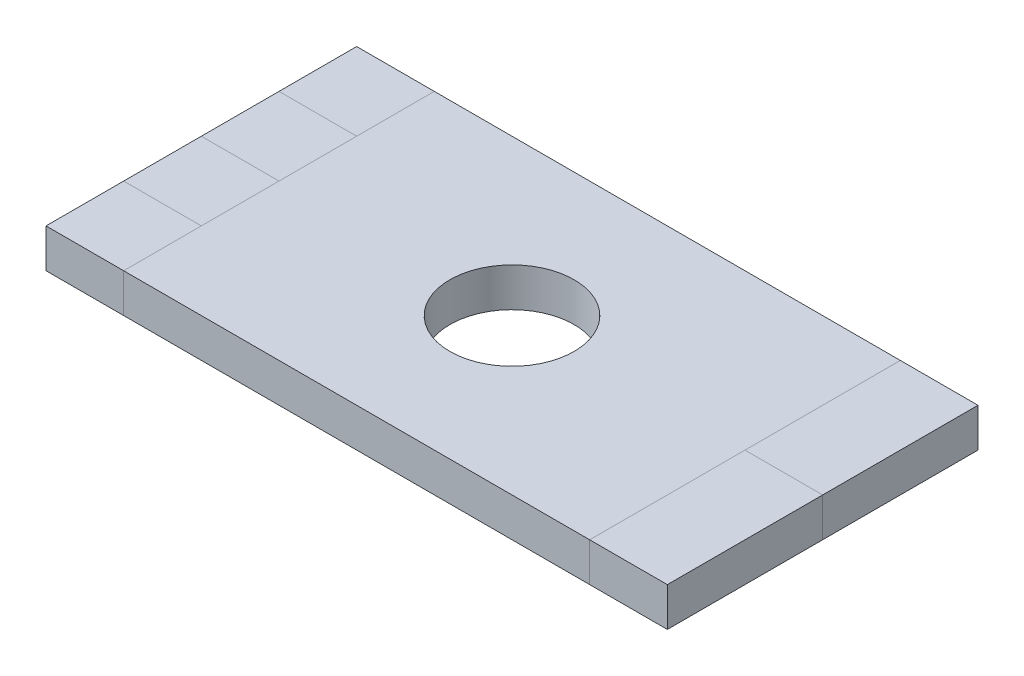
ISO-10303-21;
HEADER;
FILE_DESCRIPTION(('STEP AP214'),'2;1');
FILE_NAME('part.step','',(''),(''),'','','');
FILE_SCHEMA(('AUTOMOTIVE_DESIGN { 1 0 10303 214 1 1 1 1 }'));
ENDSEC;
DATA;
#1=APPLICATION_CONTEXT('core data for automotive mechanical design processes');
#2=APPLICATION_PROTOCOL_DEFINITION('international standard','automotive_design',2000,#1);
#3=PRODUCT_CONTEXT('',#1,'mechanical');
#4=PRODUCT('Part','Part','',(#3));
#5=PRODUCT_RELATED_PRODUCT_CATEGORY('part','',(#4));
#6=PRODUCT_DEFINITION_FORMATION('','',#4);
#7=PRODUCT_DEFINITION_CONTEXT('part definition',#1,'design');
#8=PRODUCT_DEFINITION('design','',#6,#7);
#9=PRODUCT_DEFINITION_SHAPE('','',#8);
#10=(LENGTH_UNIT() NAMED_UNIT(*) SI_UNIT(.MILLI.,.METRE.));
#11=(NAMED_UNIT(*) PLANE_ANGLE_UNIT() SI_UNIT($,.RADIAN.));
#12=(NAMED_UNIT(*) SI_UNIT($,.STERADIAN.) SOLID_ANGLE_UNIT());
#13=UNCERTAINTY_MEASURE_WITH_UNIT(LENGTH_MEASURE(1.E-05),#10,'distance_accuracy_value','');
#14=(GEOMETRIC_REPRESENTATION_CONTEXT(3) GLOBAL_UNCERTAINTY_ASSIGNED_CONTEXT((#13)) GLOBAL_UNIT_ASSIGNED_CONTEXT((#10,
#11,#12)) REPRESENTATION_CONTEXT('',''));
#15=CARTESIAN_POINT('',(0.,0.,0.));
#16=DIRECTION('',(0.,0.,1.));
#17=DIRECTION('',(1.,0.,0.));
#18=AXIS2_PLACEMENT_3D('',#15,#16,#17);
#19=CARTESIAN_POINT('',(25.4,0.,0.));
#20=DIRECTION('',(0.,0.,1.));
#21=DIRECTION('',(1.,0.,0.));
#22=AXIS2_PLACEMENT_3D('',#19,#20,#21);
#23=PLANE('',#22);
#24=DIRECTION('',(0.,1.,0.));
#25=VECTOR('',#24,1.);
#26=CARTESIAN_POINT('',(19.05,0.,0.));
#27=LINE('',#26,#25);
#28=CARTESIAN_POINT('',(19.05,0.,0.));
#29=VERTEX_POINT('',#28);
#30=CARTESIAN_POINT('',(19.05,3.175,0.));
#31=VERTEX_POINT('',#30);
#32=EDGE_CURVE('E114',#29,#31,#27,.T.);
#33=ORIENTED_EDGE('',*,*,#32,.F.);
#34=DIRECTION('',(-1.,0.,0.));
#35=VECTOR('',#34,1.);
#36=CARTESIAN_POINT('',(25.4,0.,0.));
#37=LINE('',#36,#35);
#38=CARTESIAN_POINT('',(25.4,0.,0.));
#39=VERTEX_POINT('',#38);
#40=EDGE_CURVE('E12',#39,#29,#37,.T.);
#41=ORIENTED_EDGE('',*,*,#40,.F.);
#42=DIRECTION('',(0.,1.,0.));
#43=VECTOR('',#42,1.);
#44=CARTESIAN_POINT('',(25.4,0.,0.));
#45=LINE('',#44,#43);
#46=CARTESIAN_POINT('',(25.4,3.175,0.));
#47=VERTEX_POINT('',#46);
#48=EDGE_CURVE('E102',#39,#47,#45,.T.);
#49=ORIENTED_EDGE('',*,*,#48,.T.);
#50=DIRECTION('',(-1.,0.,0.));
#51=VECTOR('',#50,1.);
#52=CARTESIAN_POINT('',(25.4,3.175,0.));
#53=LINE('',#52,#51);
#54=EDGE_CURVE('E91',#47,#31,#53,.T.);
#55=ORIENTED_EDGE('',*,*,#54,.T.);
#56=EDGE_LOOP('',(#33,#41,#49,#55));
#57=FACE_BOUND('',#56,.T.);
#58=ADVANCED_FACE('F52',(#57),#23,.T.);
#59=CARTESIAN_POINT('',(25.4,0.,0.));
#60=DIRECTION('',(0.,1.,0.));
#61=DIRECTION('',(0.,0.,1.));
#62=AXIS2_PLACEMENT_3D('',#59,#60,#61);
#63=PLANE('',#62);
#64=DIRECTION('',(0.,0.,-1.));
#65=VECTOR('',#64,1.);
#66=CARTESIAN_POINT('',(19.05,0.,0.));
#67=LINE('',#66,#65);
#68=CARTESIAN_POINT('',(19.05,0.,-12.7));
#69=VERTEX_POINT('',#68);
#70=EDGE_CURVE('E107',#29,#69,#67,.T.);
#71=ORIENTED_EDGE('',*,*,#70,.T.);
#72=DIRECTION('',(-1.,0.,0.));
#73=VECTOR('',#72,1.);
#74=CARTESIAN_POINT('',(25.4,0.,-12.7));
#75=LINE('',#74,#73);
#76=CARTESIAN_POINT('',(25.4,0.,-12.7));
#77=VERTEX_POINT('',#76);
#78=EDGE_CURVE('E60',#77,#69,#75,.T.);
#79=ORIENTED_EDGE('',*,*,#78,.F.);
#80=DIRECTION('',(0.,0.,-1.));
#81=VECTOR('',#80,1.);
#82=CARTESIAN_POINT('',(25.4,0.,0.));
#83=LINE('',#82,#81);
#84=EDGE_CURVE('E97',#39,#77,#83,.T.);
#85=ORIENTED_EDGE('',*,*,#84,.F.);
#86=ORIENTED_EDGE('',*,*,#40,.T.);
#87=EDGE_LOOP('',(#71,#79,#85,#86));
#88=FACE_BOUND('',#87,.T.);
#89=ADVANCED_FACE('F105',(#88),#63,.F.);
#90=CARTESIAN_POINT('',(25.4,0.,-12.7));
#91=DIRECTION('',(0.,0.,1.));
#92=DIRECTION('',(1.,0.,0.));
#93=AXIS2_PLACEMENT_3D('',#90,#91,#92);
#94=PLANE('',#93);
#95=DIRECTION('',(0.,1.,0.));
#96=VECTOR('',#95,1.);
#97=CARTESIAN_POINT('',(19.05,0.,-12.7));
#98=LINE('',#97,#96);
#99=CARTESIAN_POINT('',(19.05,3.175,-12.7));
#100=VERTEX_POINT('',#99);
#101=EDGE_CURVE('E84',#69,#100,#98,.T.);
#102=ORIENTED_EDGE('',*,*,#101,.T.);
#103=DIRECTION('',(-1.,0.,0.));
#104=VECTOR('',#103,1.);
#105=CARTESIAN_POINT('',(25.4,3.175,-12.7));
#106=LINE('',#105,#104);
#107=CARTESIAN_POINT('',(25.4,3.175,-12.7));
#108=VERTEX_POINT('',#107);
#109=EDGE_CURVE('E108',#108,#100,#106,.T.);
#110=ORIENTED_EDGE('',*,*,#109,.F.);
#111=DIRECTION('',(0.,1.,0.));
#112=VECTOR('',#111,1.);
#113=CARTESIAN_POINT('',(25.4,0.,-12.7));
#114=LINE('',#113,#112);
#115=EDGE_CURVE('E101',#77,#108,#114,.T.);
#116=ORIENTED_EDGE('',*,*,#115,.F.);
#117=ORIENTED_EDGE('',*,*,#78,.T.);
#118=EDGE_LOOP('',(#102,#110,#116,#117));
#119=FACE_BOUND('',#118,.T.);
#120=ADVANCED_FACE('F109',(#119),#94,.F.);
#121=CARTESIAN_POINT('',(25.4,3.175,0.));
#122=DIRECTION('',(0.,-1.,0.));
#123=DIRECTION('',(0.,0.,-1.));
#124=AXIS2_PLACEMENT_3D('',#121,#122,#123);
#125=PLANE('',#124);
#126=DIRECTION('',(0.,0.,1.));
#127=VECTOR('',#126,1.);
#128=CARTESIAN_POINT('',(19.05,3.175,0.));
#129=LINE('',#128,#127);
#130=EDGE_CURVE('E119',#100,#31,#129,.T.);
#131=ORIENTED_EDGE('',*,*,#130,.T.);
#132=ORIENTED_EDGE('',*,*,#54,.F.);
#133=DIRECTION('',(0.,0.,1.));
#134=VECTOR('',#133,1.);
#135=CARTESIAN_POINT('',(25.4,3.175,0.));
#136=LINE('',#135,#134);
#137=EDGE_CURVE('E68',#108,#47,#136,.T.);
#138=ORIENTED_EDGE('',*,*,#137,.F.);
#139=ORIENTED_EDGE('',*,*,#109,.T.);
#140=EDGE_LOOP('',(#131,#132,#138,#139));
#141=FACE_BOUND('',#140,.T.);
#142=ADVANCED_FACE('F124',(#141),#125,.F.);
#143=CARTESIAN_POINT('',(25.4,0.,0.));
#144=DIRECTION('',(1.,0.,0.));
#145=DIRECTION('',(0.,0.,-1.));
#146=AXIS2_PLACEMENT_3D('',#143,#144,#145);
#147=PLANE('',#146);
#148=ORIENTED_EDGE('',*,*,#48,.F.);
#149=ORIENTED_EDGE('',*,*,#84,.T.);
#150=ORIENTED_EDGE('',*,*,#115,.T.);
#151=ORIENTED_EDGE('',*,*,#137,.T.);
#152=EDGE_LOOP('',(#148,#149,#150,#151));
#153=FACE_BOUND('',#152,.T.);
#154=ADVANCED_FACE('F99',(#153),#147,.T.);
#155=CARTESIAN_POINT('',(19.05,0.,0.));
#156=DIRECTION('',(1.,0.,0.));
#157=DIRECTION('',(0.,0.,-1.));
#158=AXIS2_PLACEMENT_3D('',#155,#156,#157);
#159=PLANE('',#158);
#160=ORIENTED_EDGE('',*,*,#32,.T.);
#161=ORIENTED_EDGE('',*,*,#130,.F.);
#162=ORIENTED_EDGE('',*,*,#101,.F.);
#163=ORIENTED_EDGE('',*,*,#70,.F.);
#164=EDGE_LOOP('',(#160,#161,#162,#163));
#165=FACE_BOUND('',#164,.T.);
#166=ADVANCED_FACE('F126',(#165),#159,.F.);
#167=CLOSED_SHELL('',(#58,#89,#120,#142,#154,#166));
#168=MANIFOLD_SOLID_BREP('B2',#167);
#169=CARTESIAN_POINT('',(25.4,0.,0.));
#170=DIRECTION('',(0.,1.,0.));
#171=DIRECTION('',(0.,0.,1.));
#172=AXIS2_PLACEMENT_3D('',#169,#170,#171);
#173=PLANE('',#172);
#174=DIRECTION('',(0.,0.,-1.));
#175=VECTOR('',#174,1.);
#176=CARTESIAN_POINT('',(19.05,0.,0.));
#177=LINE('',#176,#175);
#178=CARTESIAN_POINT('',(19.05,0.,12.7));
#179=VERTEX_POINT('',#178);
#180=CARTESIAN_POINT('',(19.05,0.,0.));
#181=VERTEX_POINT('',#180);
#182=EDGE_CURVE('E261',#179,#181,#177,.T.);
#183=ORIENTED_EDGE('',*,*,#182,.T.);
#184=DIRECTION('',(-1.,0.,0.));
#185=VECTOR('',#184,1.);
#186=CARTESIAN_POINT('',(25.4,0.,0.));
#187=LINE('',#186,#185);
#188=CARTESIAN_POINT('',(25.4,0.,0.));
#189=VERTEX_POINT('',#188);
#190=EDGE_CURVE('E50',#189,#181,#187,.T.);
#191=ORIENTED_EDGE('',*,*,#190,.F.);
#192=DIRECTION('',(0.,0.,-1.));
#193=VECTOR('',#192,1.);
#194=CARTESIAN_POINT('',(25.4,0.,0.));
#195=LINE('',#194,#193);
#196=CARTESIAN_POINT('',(25.4,0.,12.7));
#197=VERTEX_POINT('',#196);
#198=EDGE_CURVE('E249',#197,#189,#195,.T.);
#199=ORIENTED_EDGE('',*,*,#198,.F.);
#200=DIRECTION('',(-1.,0.,0.));
#201=VECTOR('',#200,1.);
#202=CARTESIAN_POINT('',(25.4,0.,12.7));
#203=LINE('',#202,#201);
#204=EDGE_CURVE('E257',#197,#179,#203,.T.);
#205=ORIENTED_EDGE('',*,*,#204,.T.);
#206=EDGE_LOOP('',(#183,#191,#199,#205));
#207=FACE_BOUND('',#206,.T.);
#208=ADVANCED_FACE('F198',(#207),#173,.F.);
#209=CARTESIAN_POINT('',(25.4,0.,0.));
#210=DIRECTION('',(0.,0.,1.));
#211=DIRECTION('',(1.,0.,0.));
#212=AXIS2_PLACEMENT_3D('',#209,#210,#211);
#213=PLANE('',#212);
#214=DIRECTION('',(0.,1.,0.));
#215=VECTOR('',#214,1.);
#216=CARTESIAN_POINT('',(19.05,0.,0.));
#217=LINE('',#216,#215);
#218=CARTESIAN_POINT('',(19.05,3.175,0.));
#219=VERTEX_POINT('',#218);
#220=EDGE_CURVE('E253',#181,#219,#217,.T.);
#221=ORIENTED_EDGE('',*,*,#220,.T.);
#222=DIRECTION('',(-1.,0.,0.));
#223=VECTOR('',#222,1.);
#224=CARTESIAN_POINT('',(25.4,3.175,0.));
#225=LINE('',#224,#223);
#226=CARTESIAN_POINT('',(25.4,3.175,0.));
#227=VERTEX_POINT('',#226);
#228=EDGE_CURVE('E206',#227,#219,#225,.T.);
#229=ORIENTED_EDGE('',*,*,#228,.F.);
#230=DIRECTION('',(0.,1.,0.));
#231=VECTOR('',#230,1.);
#232=CARTESIAN_POINT('',(25.4,0.,0.));
#233=LINE('',#232,#231);
#234=EDGE_CURVE('E244',#189,#227,#233,.T.);
#235=ORIENTED_EDGE('',*,*,#234,.F.);
#236=ORIENTED_EDGE('',*,*,#190,.T.);
#237=EDGE_LOOP('',(#221,#229,#235,#236));
#238=FACE_BOUND('',#237,.T.);
#239=ADVANCED_FACE('F252',(#238),#213,.F.);
#240=CARTESIAN_POINT('',(25.4,3.175,0.));
#241=DIRECTION('',(0.,-1.,0.));
#242=DIRECTION('',(0.,0.,-1.));
#243=AXIS2_PLACEMENT_3D('',#240,#241,#242);
#244=PLANE('',#243);
#245=DIRECTION('',(0.,0.,1.));
#246=VECTOR('',#245,1.);
#247=CARTESIAN_POINT('',(19.05,3.175,0.));
#248=LINE('',#247,#246);
#249=CARTESIAN_POINT('',(19.05,3.175,12.7));
#250=VERTEX_POINT('',#249);
#251=EDGE_CURVE('E231',#219,#250,#248,.T.);
#252=ORIENTED_EDGE('',*,*,#251,.T.);
#253=DIRECTION('',(-1.,0.,0.));
#254=VECTOR('',#253,1.);
#255=CARTESIAN_POINT('',(25.4,3.175,12.7));
#256=LINE('',#255,#254);
#257=CARTESIAN_POINT('',(25.4,3.175,12.7));
#258=VERTEX_POINT('',#257);
#259=EDGE_CURVE('E254',#258,#250,#256,.T.);
#260=ORIENTED_EDGE('',*,*,#259,.F.);
#261=DIRECTION('',(0.,0.,1.));
#262=VECTOR('',#261,1.);
#263=CARTESIAN_POINT('',(25.4,3.175,0.));
#264=LINE('',#263,#262);
#265=EDGE_CURVE('E247',#227,#258,#264,.T.);
#266=ORIENTED_EDGE('',*,*,#265,.F.);
#267=ORIENTED_EDGE('',*,*,#228,.T.);
#268=EDGE_LOOP('',(#252,#260,#266,#267));
#269=FACE_BOUND('',#268,.T.);
#270=ADVANCED_FACE('F255',(#269),#244,.F.);
#271=CARTESIAN_POINT('',(25.4,0.,12.7));
#272=DIRECTION('',(0.,0.,-1.));
#273=DIRECTION('',(-1.,0.,0.));
#274=AXIS2_PLACEMENT_3D('',#271,#272,#273);
#275=PLANE('',#274);
#276=DIRECTION('',(0.,-1.,0.));
#277=VECTOR('',#276,1.);
#278=CARTESIAN_POINT('',(19.05,0.,12.7));
#279=LINE('',#278,#277);
#280=EDGE_CURVE('E237',#250,#179,#279,.T.);
#281=ORIENTED_EDGE('',*,*,#280,.T.);
#282=ORIENTED_EDGE('',*,*,#204,.F.);
#283=DIRECTION('',(0.,-1.,0.));
#284=VECTOR('',#283,1.);
#285=CARTESIAN_POINT('',(25.4,0.,12.7));
#286=LINE('',#285,#284);
#287=EDGE_CURVE('E214',#258,#197,#286,.T.);
#288=ORIENTED_EDGE('',*,*,#287,.F.);
#289=ORIENTED_EDGE('',*,*,#259,.T.);
#290=EDGE_LOOP('',(#281,#282,#288,#289));
#291=FACE_BOUND('',#290,.T.);
#292=ADVANCED_FACE('F268',(#291),#275,.F.);
#293=CARTESIAN_POINT('',(25.4,0.,0.));
#294=DIRECTION('',(1.,0.,0.));
#295=DIRECTION('',(0.,0.,-1.));
#296=AXIS2_PLACEMENT_3D('',#293,#294,#295);
#297=PLANE('',#296);
#298=ORIENTED_EDGE('',*,*,#198,.T.);
#299=ORIENTED_EDGE('',*,*,#234,.T.);
#300=ORIENTED_EDGE('',*,*,#265,.T.);
#301=ORIENTED_EDGE('',*,*,#287,.T.);
#302=EDGE_LOOP('',(#298,#299,#300,#301));
#303=FACE_BOUND('',#302,.T.);
#304=ADVANCED_FACE('F245',(#303),#297,.T.);
#305=CARTESIAN_POINT('',(19.05,0.,0.));
#306=DIRECTION('',(1.,0.,0.));
#307=DIRECTION('',(0.,0.,-1.));
#308=AXIS2_PLACEMENT_3D('',#305,#306,#307);
#309=PLANE('',#308);
#310=ORIENTED_EDGE('',*,*,#182,.F.);
#311=ORIENTED_EDGE('',*,*,#280,.F.);
#312=ORIENTED_EDGE('',*,*,#251,.F.);
#313=ORIENTED_EDGE('',*,*,#220,.F.);
#314=EDGE_LOOP('',(#310,#311,#312,#313));
#315=FACE_BOUND('',#314,.T.);
#316=ADVANCED_FACE('F271',(#315),#309,.F.);
#317=CLOSED_SHELL('',(#208,#239,#270,#292,#304,#316));
#318=MANIFOLD_SOLID_BREP('B6',#317);
#319=CARTESIAN_POINT('',(-25.4,3.175,0.));
#320=DIRECTION('',(0.,-1.,0.));
#321=DIRECTION('',(0.,0.,-1.));
#322=AXIS2_PLACEMENT_3D('',#319,#320,#321);
#323=PLANE('',#322);
#324=DIRECTION('',(0.,0.,-1.));
#325=VECTOR('',#324,1.);
#326=CARTESIAN_POINT('',(-19.05,3.175,0.));
#327=LINE('',#326,#325);
#328=CARTESIAN_POINT('',(-19.05,3.175,12.7));
#329=VERTEX_POINT('',#328);
#330=CARTESIAN_POINT('',(-19.05,3.175,6.35));
#331=VERTEX_POINT('',#330);
#332=EDGE_CURVE('E407',#329,#331,#327,.T.);
#333=ORIENTED_EDGE('',*,*,#332,.T.);
#334=DIRECTION('',(1.,0.,0.));
#335=VECTOR('',#334,1.);
#336=CARTESIAN_POINT('',(-25.4,3.175,6.35));
#337=LINE('',#336,#335);
#338=CARTESIAN_POINT('',(-25.4,3.175,6.35));
#339=VERTEX_POINT('',#338);
#340=EDGE_CURVE('E196',#339,#331,#337,.T.);
#341=ORIENTED_EDGE('',*,*,#340,.F.);
#342=DIRECTION('',(0.,0.,-1.));
#343=VECTOR('',#342,1.);
#344=CARTESIAN_POINT('',(-25.4,3.175,0.));
#345=LINE('',#344,#343);
#346=CARTESIAN_POINT('',(-25.4,3.175,12.7));
#347=VERTEX_POINT('',#346);
#348=EDGE_CURVE('E395',#347,#339,#345,.T.);
#349=ORIENTED_EDGE('',*,*,#348,.F.);
#350=DIRECTION('',(1.,0.,0.));
#351=VECTOR('',#350,1.);
#352=CARTESIAN_POINT('',(-25.4,3.175,12.7));
#353=LINE('',#352,#351);
#354=EDGE_CURVE('E403',#347,#329,#353,.T.);
#355=ORIENTED_EDGE('',*,*,#354,.T.);
#356=EDGE_LOOP('',(#333,#341,#349,#355));
#357=FACE_BOUND('',#356,.T.);
#358=ADVANCED_FACE('F344',(#357),#323,.F.);
#359=CARTESIAN_POINT('',(-25.4,0.,6.35));
#360=DIRECTION('',(0.,0.,1.));
#361=DIRECTION('',(0.,-1.,0.));
#362=AXIS2_PLACEMENT_3D('',#359,#360,#361);
#363=PLANE('',#362);
#364=DIRECTION('',(0.,-1.,0.));
#365=VECTOR('',#364,1.);
#366=CARTESIAN_POINT('',(-19.05,0.,6.35));
#367=LINE('',#366,#365);
#368=CARTESIAN_POINT('',(-19.05,0.,6.35));
#369=VERTEX_POINT('',#368);
#370=EDGE_CURVE('E399',#331,#369,#367,.T.);
#371=ORIENTED_EDGE('',*,*,#370,.T.);
#372=DIRECTION('',(1.,0.,0.));
#373=VECTOR('',#372,1.);
#374=CARTESIAN_POINT('',(-25.4,0.,6.35));
#375=LINE('',#374,#373);
#376=CARTESIAN_POINT('',(-25.4,0.,6.35));
#377=VERTEX_POINT('',#376);
#378=EDGE_CURVE('E352',#377,#369,#375,.T.);
#379=ORIENTED_EDGE('',*,*,#378,.F.);
#380=DIRECTION('',(0.,-1.,0.));
#381=VECTOR('',#380,1.);
#382=CARTESIAN_POINT('',(-25.4,0.,6.35));
#383=LINE('',#382,#381);
#384=EDGE_CURVE('E390',#339,#377,#383,.T.);
#385=ORIENTED_EDGE('',*,*,#384,.F.);
#386=ORIENTED_EDGE('',*,*,#340,.T.);
#387=EDGE_LOOP('',(#371,#379,#385,#386));
#388=FACE_BOUND('',#387,.T.);
#389=ADVANCED_FACE('F398',(#388),#363,.F.);
#390=CARTESIAN_POINT('',(-25.4,0.,0.));
#391=DIRECTION('',(0.,1.,0.));
#392=DIRECTION('',(0.,0.,1.));
#393=AXIS2_PLACEMENT_3D('',#390,#391,#392);
#394=PLANE('',#393);
#395=DIRECTION('',(0.,0.,1.));
#396=VECTOR('',#395,1.);
#397=CARTESIAN_POINT('',(-19.05,0.,0.));
#398=LINE('',#397,#396);
#399=CARTESIAN_POINT('',(-19.05,0.,12.7));
#400=VERTEX_POINT('',#399);
#401=EDGE_CURVE('E377',#369,#400,#398,.T.);
#402=ORIENTED_EDGE('',*,*,#401,.T.);
#403=DIRECTION('',(1.,0.,0.));
#404=VECTOR('',#403,1.);
#405=CARTESIAN_POINT('',(-25.4,0.,12.7));
#406=LINE('',#405,#404);
#407=CARTESIAN_POINT('',(-25.4,0.,12.7));
#408=VERTEX_POINT('',#407);
#409=EDGE_CURVE('E400',#408,#400,#406,.T.);
#410=ORIENTED_EDGE('',*,*,#409,.F.);
#411=DIRECTION('',(0.,0.,1.));
#412=VECTOR('',#411,1.);
#413=CARTESIAN_POINT('',(-25.4,0.,0.));
#414=LINE('',#413,#412);
#415=EDGE_CURVE('E393',#377,#408,#414,.T.);
#416=ORIENTED_EDGE('',*,*,#415,.F.);
#417=ORIENTED_EDGE('',*,*,#378,.T.);
#418=EDGE_LOOP('',(#402,#410,#416,#417));
#419=FACE_BOUND('',#418,.T.);
#420=ADVANCED_FACE('F401',(#419),#394,.F.);
#421=CARTESIAN_POINT('',(-25.4,0.,12.7));
#422=DIRECTION('',(0.,0.,-1.));
#423=DIRECTION('',(-1.,0.,0.));
#424=AXIS2_PLACEMENT_3D('',#421,#422,#423);
#425=PLANE('',#424);
#426=DIRECTION('',(0.,1.,0.));
#427=VECTOR('',#426,1.);
#428=CARTESIAN_POINT('',(-19.05,0.,12.7));
#429=LINE('',#428,#427);
#430=EDGE_CURVE('E383',#400,#329,#429,.T.);
#431=ORIENTED_EDGE('',*,*,#430,.T.);
#432=ORIENTED_EDGE('',*,*,#354,.F.);
#433=DIRECTION('',(0.,1.,0.));
#434=VECTOR('',#433,1.);
#435=CARTESIAN_POINT('',(-25.4,0.,12.7));
#436=LINE('',#435,#434);
#437=EDGE_CURVE('E360',#408,#347,#436,.T.);
#438=ORIENTED_EDGE('',*,*,#437,.F.);
#439=ORIENTED_EDGE('',*,*,#409,.T.);
#440=EDGE_LOOP('',(#431,#432,#438,#439));
#441=FACE_BOUND('',#440,.T.);
#442=ADVANCED_FACE('F414',(#441),#425,.F.);
#443=CARTESIAN_POINT('',(-25.4,0.,0.));
#444=DIRECTION('',(-1.,0.,0.));
#445=DIRECTION('',(0.,0.,1.));
#446=AXIS2_PLACEMENT_3D('',#443,#444,#445);
#447=PLANE('',#446);
#448=ORIENTED_EDGE('',*,*,#348,.T.);
#449=ORIENTED_EDGE('',*,*,#384,.T.);
#450=ORIENTED_EDGE('',*,*,#415,.T.);
#451=ORIENTED_EDGE('',*,*,#437,.T.);
#452=EDGE_LOOP('',(#448,#449,#450,#451));
#453=FACE_BOUND('',#452,.T.);
#454=ADVANCED_FACE('F391',(#453),#447,.T.);
#455=CARTESIAN_POINT('',(-19.05,0.,0.));
#456=DIRECTION('',(-1.,0.,0.));
#457=DIRECTION('',(0.,0.,1.));
#458=AXIS2_PLACEMENT_3D('',#455,#456,#457);
#459=PLANE('',#458);
#460=ORIENTED_EDGE('',*,*,#332,.F.);
#461=ORIENTED_EDGE('',*,*,#430,.F.);
#462=ORIENTED_EDGE('',*,*,#401,.F.);
#463=ORIENTED_EDGE('',*,*,#370,.F.);
#464=EDGE_LOOP('',(#460,#461,#462,#463));
#465=FACE_BOUND('',#464,.T.);
#466=ADVANCED_FACE('F417',(#465),#459,.F.);
#467=CLOSED_SHELL('',(#358,#389,#420,#442,#454,#466));
#468=MANIFOLD_SOLID_BREP('B44',#467);
#469=CARTESIAN_POINT('',(-25.4,0.,6.35));
#470=DIRECTION('',(0.,0.,1.));
#471=DIRECTION('',(0.,-1.,0.));
#472=AXIS2_PLACEMENT_3D('',#469,#470,#471);
#473=PLANE('',#472);
#474=DIRECTION('',(0.,-1.,0.));
#475=VECTOR('',#474,1.);
#476=CARTESIAN_POINT('',(-19.05,0.,6.35));
#477=LINE('',#476,#475);
#478=CARTESIAN_POINT('',(-19.05,3.175,6.35));
#479=VERTEX_POINT('',#478);
#480=CARTESIAN_POINT('',(-19.05,0.,6.35));
#481=VERTEX_POINT('',#480);
#482=EDGE_CURVE('E553',#479,#481,#477,.T.);
#483=ORIENTED_EDGE('',*,*,#482,.F.);
#484=DIRECTION('',(1.,0.,0.));
#485=VECTOR('',#484,1.);
#486=CARTESIAN_POINT('',(-25.4,3.175,6.35));
#487=LINE('',#486,#485);
#488=CARTESIAN_POINT('',(-25.4,3.175,6.35));
#489=VERTEX_POINT('',#488);
#490=EDGE_CURVE('E342',#489,#479,#487,.T.);
#491=ORIENTED_EDGE('',*,*,#490,.F.);
#492=DIRECTION('',(0.,-1.,0.));
#493=VECTOR('',#492,1.);
#494=CARTESIAN_POINT('',(-25.4,0.,6.35));
#495=LINE('',#494,#493);
#496=CARTESIAN_POINT('',(-25.4,0.,6.35));
#497=VERTEX_POINT('',#496);
#498=EDGE_CURVE('E538',#489,#497,#495,.T.);
#499=ORIENTED_EDGE('',*,*,#498,.T.);
#500=DIRECTION('',(1.,0.,0.));
#501=VECTOR('',#500,1.);
#502=CARTESIAN_POINT('',(-25.4,0.,6.35));
#503=LINE('',#502,#501);
#504=EDGE_CURVE('E528',#497,#481,#503,.T.);
#505=ORIENTED_EDGE('',*,*,#504,.T.);
#506=EDGE_LOOP('',(#483,#491,#499,#505));
#507=FACE_BOUND('',#506,.T.);
#508=ADVANCED_FACE('F490',(#507),#473,.T.);
#509=CARTESIAN_POINT('',(-25.4,3.175,0.));
#510=DIRECTION('',(0.,-1.,0.));
#511=DIRECTION('',(0.,0.,-1.));
#512=AXIS2_PLACEMENT_3D('',#509,#510,#511);
#513=PLANE('',#512);
#514=DIRECTION('',(0.,0.,-1.));
#515=VECTOR('',#514,1.);
#516=CARTESIAN_POINT('',(-19.05,3.175,0.));
#517=LINE('',#516,#515);
#518=CARTESIAN_POINT('',(-19.05,3.175,0.));
#519=VERTEX_POINT('',#518);
#520=EDGE_CURVE('E544',#479,#519,#517,.T.);
#521=ORIENTED_EDGE('',*,*,#520,.T.);
#522=DIRECTION('',(1.,0.,0.));
#523=VECTOR('',#522,1.);
#524=CARTESIAN_POINT('',(-25.4,3.175,0.));
#525=LINE('',#524,#523);
#526=CARTESIAN_POINT('',(-25.4,3.175,0.));
#527=VERTEX_POINT('',#526);
#528=EDGE_CURVE('E498',#527,#519,#525,.T.);
#529=ORIENTED_EDGE('',*,*,#528,.F.);
#530=DIRECTION('',(0.,0.,-1.));
#531=VECTOR('',#530,1.);
#532=CARTESIAN_POINT('',(-25.4,3.175,0.));
#533=LINE('',#532,#531);
#534=EDGE_CURVE('E533',#489,#527,#533,.T.);
#535=ORIENTED_EDGE('',*,*,#534,.F.);
#536=ORIENTED_EDGE('',*,*,#490,.T.);
#537=EDGE_LOOP('',(#521,#529,#535,#536));
#538=FACE_BOUND('',#537,.T.);
#539=ADVANCED_FACE('F542',(#538),#513,.F.);
#540=CARTESIAN_POINT('',(-25.4,0.,0.));
#541=DIRECTION('',(0.,0.,-1.));
#542=DIRECTION('',(-1.,0.,0.));
#543=AXIS2_PLACEMENT_3D('',#540,#541,#542);
#544=PLANE('',#543);
#545=DIRECTION('',(0.,1.,0.));
#546=VECTOR('',#545,1.);
#547=CARTESIAN_POINT('',(-19.05,0.,0.));
#548=LINE('',#547,#546);
#549=CARTESIAN_POINT('',(-19.05,0.,0.));
#550=VERTEX_POINT('',#549);
#551=EDGE_CURVE('E557',#550,#519,#548,.T.);
#552=ORIENTED_EDGE('',*,*,#551,.F.);
#553=DIRECTION('',(1.,0.,0.));
#554=VECTOR('',#553,1.);
#555=CARTESIAN_POINT('',(-25.4,0.,0.));
#556=LINE('',#555,#554);
#557=CARTESIAN_POINT('',(-25.4,0.,0.));
#558=VERTEX_POINT('',#557);
#559=EDGE_CURVE('E521',#558,#550,#556,.T.);
#560=ORIENTED_EDGE('',*,*,#559,.F.);
#561=DIRECTION('',(0.,1.,0.));
#562=VECTOR('',#561,1.);
#563=CARTESIAN_POINT('',(-25.4,0.,0.));
#564=LINE('',#563,#562);
#565=EDGE_CURVE('E537',#558,#527,#564,.T.);
#566=ORIENTED_EDGE('',*,*,#565,.T.);
#567=ORIENTED_EDGE('',*,*,#528,.T.);
#568=EDGE_LOOP('',(#552,#560,#566,#567));
#569=FACE_BOUND('',#568,.T.);
#570=ADVANCED_FACE('F548',(#569),#544,.T.);
#571=CARTESIAN_POINT('',(-25.4,0.,0.));
#572=DIRECTION('',(0.,1.,0.));
#573=DIRECTION('',(0.,0.,1.));
#574=AXIS2_PLACEMENT_3D('',#571,#572,#573);
#575=PLANE('',#574);
#576=DIRECTION('',(0.,0.,1.));
#577=VECTOR('',#576,1.);
#578=CARTESIAN_POINT('',(-19.05,0.,0.));
#579=LINE('',#578,#577);
#580=EDGE_CURVE('E559',#550,#481,#579,.T.);
#581=ORIENTED_EDGE('',*,*,#580,.T.);
#582=ORIENTED_EDGE('',*,*,#504,.F.);
#583=DIRECTION('',(0.,0.,1.));
#584=VECTOR('',#583,1.);
#585=CARTESIAN_POINT('',(-25.4,0.,0.));
#586=LINE('',#585,#584);
#587=EDGE_CURVE('E506',#558,#497,#586,.T.);
#588=ORIENTED_EDGE('',*,*,#587,.F.);
#589=ORIENTED_EDGE('',*,*,#559,.T.);
#590=EDGE_LOOP('',(#581,#582,#588,#589));
#591=FACE_BOUND('',#590,.T.);
#592=ADVANCED_FACE('F569',(#591),#575,.F.);
#593=CARTESIAN_POINT('',(-25.4,0.,0.));
#594=DIRECTION('',(-1.,0.,0.));
#595=DIRECTION('',(0.,0.,1.));
#596=AXIS2_PLACEMENT_3D('',#593,#594,#595);
#597=PLANE('',#596);
#598=ORIENTED_EDGE('',*,*,#498,.F.);
#599=ORIENTED_EDGE('',*,*,#534,.T.);
#600=ORIENTED_EDGE('',*,*,#565,.F.);
#601=ORIENTED_EDGE('',*,*,#587,.T.);
#602=EDGE_LOOP('',(#598,#599,#600,#601));
#603=FACE_BOUND('',#602,.T.);
#604=ADVANCED_FACE('F535',(#603),#597,.T.);
#605=CARTESIAN_POINT('',(-19.05,0.,0.));
#606=DIRECTION('',(-1.,0.,0.));
#607=DIRECTION('',(0.,0.,1.));
#608=AXIS2_PLACEMENT_3D('',#605,#606,#607);
#609=PLANE('',#608);
#610=ORIENTED_EDGE('',*,*,#482,.T.);
#611=ORIENTED_EDGE('',*,*,#580,.F.);
#612=ORIENTED_EDGE('',*,*,#551,.T.);
#613=ORIENTED_EDGE('',*,*,#520,.F.);
#614=EDGE_LOOP('',(#610,#611,#612,#613));
#615=FACE_BOUND('',#614,.T.);
#616=ADVANCED_FACE('F574',(#615),#609,.F.);
#617=CLOSED_SHELL('',(#508,#539,#570,#592,#604,#616));
#618=MANIFOLD_SOLID_BREP('B190',#617);
#619=CARTESIAN_POINT('',(-25.4,0.,0.));
#620=DIRECTION('',(0.,1.,0.));
#621=DIRECTION('',(0.,0.,1.));
#622=AXIS2_PLACEMENT_3D('',#619,#620,#621);
#623=PLANE('',#622);
#624=DIRECTION('',(0.,0.,1.));
#625=VECTOR('',#624,1.);
#626=CARTESIAN_POINT('',(-19.05,0.,0.));
#627=LINE('',#626,#625);
#628=CARTESIAN_POINT('',(-19.05,0.,-6.35));
#629=VERTEX_POINT('',#628);
#630=CARTESIAN_POINT('',(-19.05,0.,0.));
#631=VERTEX_POINT('',#630);
#632=EDGE_CURVE('E699',#629,#631,#627,.T.);
#633=ORIENTED_EDGE('',*,*,#632,.T.);
#634=DIRECTION('',(1.,0.,0.));
#635=VECTOR('',#634,1.);
#636=CARTESIAN_POINT('',(-25.4,0.,0.));
#637=LINE('',#636,#635);
#638=CARTESIAN_POINT('',(-25.4,0.,0.));
#639=VERTEX_POINT('',#638);
#640=EDGE_CURVE('E488',#639,#631,#637,.T.);
#641=ORIENTED_EDGE('',*,*,#640,.F.);
#642=DIRECTION('',(0.,0.,1.));
#643=VECTOR('',#642,1.);
#644=CARTESIAN_POINT('',(-25.4,0.,0.));
#645=LINE('',#644,#643);
#646=CARTESIAN_POINT('',(-25.4,0.,-6.35));
#647=VERTEX_POINT('',#646);
#648=EDGE_CURVE('E687',#647,#639,#645,.T.);
#649=ORIENTED_EDGE('',*,*,#648,.F.);
#650=DIRECTION('',(1.,0.,0.));
#651=VECTOR('',#650,1.);
#652=CARTESIAN_POINT('',(-25.4,0.,-6.35));
#653=LINE('',#652,#651);
#654=EDGE_CURVE('E695',#647,#629,#653,.T.);
#655=ORIENTED_EDGE('',*,*,#654,.T.);
#656=EDGE_LOOP('',(#633,#641,#649,#655));
#657=FACE_BOUND('',#656,.T.);
#658=ADVANCED_FACE('F636',(#657),#623,.F.);
#659=CARTESIAN_POINT('',(-25.4,0.,0.));
#660=DIRECTION('',(0.,0.,-1.));
#661=DIRECTION('',(-1.,0.,0.));
#662=AXIS2_PLACEMENT_3D('',#659,#660,#661);
#663=PLANE('',#662);
#664=DIRECTION('',(0.,1.,0.));
#665=VECTOR('',#664,1.);
#666=CARTESIAN_POINT('',(-19.05,0.,0.));
#667=LINE('',#666,#665);
#668=CARTESIAN_POINT('',(-19.05,3.175,0.));
#669=VERTEX_POINT('',#668);
#670=EDGE_CURVE('E691',#631,#669,#667,.T.);
#671=ORIENTED_EDGE('',*,*,#670,.T.);
#672=DIRECTION('',(1.,0.,0.));
#673=VECTOR('',#672,1.);
#674=CARTESIAN_POINT('',(-25.4,3.175,0.));
#675=LINE('',#674,#673);
#676=CARTESIAN_POINT('',(-25.4,3.175,0.));
#677=VERTEX_POINT('',#676);
#678=EDGE_CURVE('E644',#677,#669,#675,.T.);
#679=ORIENTED_EDGE('',*,*,#678,.F.);
#680=DIRECTION('',(0.,1.,0.));
#681=VECTOR('',#680,1.);
#682=CARTESIAN_POINT('',(-25.4,0.,0.));
#683=LINE('',#682,#681);
#684=EDGE_CURVE('E682',#639,#677,#683,.T.);
#685=ORIENTED_EDGE('',*,*,#684,.F.);
#686=ORIENTED_EDGE('',*,*,#640,.T.);
#687=EDGE_LOOP('',(#671,#679,#685,#686));
#688=FACE_BOUND('',#687,.T.);
#689=ADVANCED_FACE('F690',(#688),#663,.F.);
#690=CARTESIAN_POINT('',(-25.4,3.175,0.));
#691=DIRECTION('',(0.,-1.,0.));
#692=DIRECTION('',(0.,0.,-1.));
#693=AXIS2_PLACEMENT_3D('',#690,#691,#692);
#694=PLANE('',#693);
#695=DIRECTION('',(0.,0.,-1.));
#696=VECTOR('',#695,1.);
#697=CARTESIAN_POINT('',(-19.05,3.175,0.));
#698=LINE('',#697,#696);
#699=CARTESIAN_POINT('',(-19.05,3.175,-6.35));
#700=VERTEX_POINT('',#699);
#701=EDGE_CURVE('E669',#669,#700,#698,.T.);
#702=ORIENTED_EDGE('',*,*,#701,.T.);
#703=DIRECTION('',(1.,0.,0.));
#704=VECTOR('',#703,1.);
#705=CARTESIAN_POINT('',(-25.4,3.175,-6.35));
#706=LINE('',#705,#704);
#707=CARTESIAN_POINT('',(-25.4,3.175,-6.35));
#708=VERTEX_POINT('',#707);
#709=EDGE_CURVE('E692',#708,#700,#706,.T.);
#710=ORIENTED_EDGE('',*,*,#709,.F.);
#711=DIRECTION('',(0.,0.,-1.));
#712=VECTOR('',#711,1.);
#713=CARTESIAN_POINT('',(-25.4,3.175,0.));
#714=LINE('',#713,#712);
#715=EDGE_CURVE('E685',#677,#708,#714,.T.);
#716=ORIENTED_EDGE('',*,*,#715,.F.);
#717=ORIENTED_EDGE('',*,*,#678,.T.);
#718=EDGE_LOOP('',(#702,#710,#716,#717));
#719=FACE_BOUND('',#718,.T.);
#720=ADVANCED_FACE('F693',(#719),#694,.F.);
#721=CARTESIAN_POINT('',(-25.4,0.,-6.35));
#722=DIRECTION('',(0.,0.,1.));
#723=DIRECTION('',(1.,0.,0.));
#724=AXIS2_PLACEMENT_3D('',#721,#722,#723);
#725=PLANE('',#724);
#726=DIRECTION('',(0.,-1.,0.));
#727=VECTOR('',#726,1.);
#728=CARTESIAN_POINT('',(-19.05,0.,-6.35));
#729=LINE('',#728,#727);
#730=EDGE_CURVE('E675',#700,#629,#729,.T.);
#731=ORIENTED_EDGE('',*,*,#730,.T.);
#732=ORIENTED_EDGE('',*,*,#654,.F.);
#733=DIRECTION('',(0.,-1.,0.));
#734=VECTOR('',#733,1.);
#735=CARTESIAN_POINT('',(-25.4,0.,-6.35));
#736=LINE('',#735,#734);
#737=EDGE_CURVE('E652',#708,#647,#736,.T.);
#738=ORIENTED_EDGE('',*,*,#737,.F.);
#739=ORIENTED_EDGE('',*,*,#709,.T.);
#740=EDGE_LOOP('',(#731,#732,#738,#739));
#741=FACE_BOUND('',#740,.T.);
#742=ADVANCED_FACE('F706',(#741),#725,.F.);
#743=CARTESIAN_POINT('',(-25.4,0.,0.));
#744=DIRECTION('',(-1.,0.,0.));
#745=DIRECTION('',(0.,0.,1.));
#746=AXIS2_PLACEMENT_3D('',#743,#744,#745);
#747=PLANE('',#746);
#748=ORIENTED_EDGE('',*,*,#648,.T.);
#749=ORIENTED_EDGE('',*,*,#684,.T.);
#750=ORIENTED_EDGE('',*,*,#715,.T.);
#751=ORIENTED_EDGE('',*,*,#737,.T.);
#752=EDGE_LOOP('',(#748,#749,#750,#751));
#753=FACE_BOUND('',#752,.T.);
#754=ADVANCED_FACE('F683',(#753),#747,.T.);
#755=CARTESIAN_POINT('',(-19.05,0.,0.));
#756=DIRECTION('',(-1.,0.,0.));
#757=DIRECTION('',(0.,0.,1.));
#758=AXIS2_PLACEMENT_3D('',#755,#756,#757);
#759=PLANE('',#758);
#760=ORIENTED_EDGE('',*,*,#632,.F.);
#761=ORIENTED_EDGE('',*,*,#730,.F.);
#762=ORIENTED_EDGE('',*,*,#701,.F.);
#763=ORIENTED_EDGE('',*,*,#670,.F.);
#764=EDGE_LOOP('',(#760,#761,#762,#763));
#765=FACE_BOUND('',#764,.T.);
#766=ADVANCED_FACE('F709',(#765),#759,.F.);
#767=CLOSED_SHELL('',(#658,#689,#720,#742,#754,#766));
#768=MANIFOLD_SOLID_BREP('B336',#767);
#769=CARTESIAN_POINT('',(-25.4,0.,-6.35));
#770=DIRECTION('',(0.,0.,1.));
#771=DIRECTION('',(1.,0.,0.));
#772=AXIS2_PLACEMENT_3D('',#769,#770,#771);
#773=PLANE('',#772);
#774=DIRECTION('',(0.,-1.,0.));
#775=VECTOR('',#774,1.);
#776=CARTESIAN_POINT('',(-19.05,0.,-6.35));
#777=LINE('',#776,#775);
#778=CARTESIAN_POINT('',(-19.05,3.175,-6.35));
#779=VERTEX_POINT('',#778);
#780=CARTESIAN_POINT('',(-19.05,0.,-6.35));
#781=VERTEX_POINT('',#780);
#782=EDGE_CURVE('E843',#779,#781,#777,.T.);
#783=ORIENTED_EDGE('',*,*,#782,.F.);
#784=DIRECTION('',(1.,0.,0.));
#785=VECTOR('',#784,1.);
#786=CARTESIAN_POINT('',(-25.4,3.175,-6.35));
#787=LINE('',#786,#785);
#788=CARTESIAN_POINT('',(-25.4,3.175,-6.35));
#789=VERTEX_POINT('',#788);
#790=EDGE_CURVE('E634',#789,#779,#787,.T.);
#791=ORIENTED_EDGE('',*,*,#790,.F.);
#792=DIRECTION('',(0.,-1.,0.));
#793=VECTOR('',#792,1.);
#794=CARTESIAN_POINT('',(-25.4,0.,-6.35));
#795=LINE('',#794,#793);
#796=CARTESIAN_POINT('',(-25.4,0.,-6.35));
#797=VERTEX_POINT('',#796);
#798=EDGE_CURVE('E831',#789,#797,#795,.T.);
#799=ORIENTED_EDGE('',*,*,#798,.T.);
#800=DIRECTION('',(1.,0.,0.));
#801=VECTOR('',#800,1.);
#802=CARTESIAN_POINT('',(-25.4,0.,-6.35));
#803=LINE('',#802,#801);
#804=EDGE_CURVE('E820',#797,#781,#803,.T.);
#805=ORIENTED_EDGE('',*,*,#804,.T.);
#806=EDGE_LOOP('',(#783,#791,#799,#805));
#807=FACE_BOUND('',#806,.T.);
#808=ADVANCED_FACE('F781',(#807),#773,.T.);
#809=CARTESIAN_POINT('',(-25.4,3.175,0.));
#810=DIRECTION('',(0.,-1.,0.));
#811=DIRECTION('',(0.,0.,-1.));
#812=AXIS2_PLACEMENT_3D('',#809,#810,#811);
#813=PLANE('',#812);
#814=DIRECTION('',(0.,0.,-1.));
#815=VECTOR('',#814,1.);
#816=CARTESIAN_POINT('',(-19.05,3.175,0.));
#817=LINE('',#816,#815);
#818=CARTESIAN_POINT('',(-19.05,3.175,-12.7));
#819=VERTEX_POINT('',#818);
#820=EDGE_CURVE('E836',#779,#819,#817,.T.);
#821=ORIENTED_EDGE('',*,*,#820,.T.);
#822=DIRECTION('',(1.,0.,0.));
#823=VECTOR('',#822,1.);
#824=CARTESIAN_POINT('',(-25.4,3.175,-12.7));
#825=LINE('',#824,#823);
#826=CARTESIAN_POINT('',(-25.4,3.175,-12.7));
#827=VERTEX_POINT('',#826);
#828=EDGE_CURVE('E789',#827,#819,#825,.T.);
#829=ORIENTED_EDGE('',*,*,#828,.F.);
#830=DIRECTION('',(0.,0.,-1.));
#831=VECTOR('',#830,1.);
#832=CARTESIAN_POINT('',(-25.4,3.175,0.));
#833=LINE('',#832,#831);
#834=EDGE_CURVE('E826',#789,#827,#833,.T.);
#835=ORIENTED_EDGE('',*,*,#834,.F.);
#836=ORIENTED_EDGE('',*,*,#790,.T.);
#837=EDGE_LOOP('',(#821,#829,#835,#836));
#838=FACE_BOUND('',#837,.T.);
#839=ADVANCED_FACE('F834',(#838),#813,.F.);
#840=CARTESIAN_POINT('',(-25.4,0.,-12.7));
#841=DIRECTION('',(0.,0.,1.));
#842=DIRECTION('',(1.,0.,0.));
#843=AXIS2_PLACEMENT_3D('',#840,#841,#842);
#844=PLANE('',#843);
#845=DIRECTION('',(0.,-1.,0.));
#846=VECTOR('',#845,1.);
#847=CARTESIAN_POINT('',(-19.05,0.,-12.7));
#848=LINE('',#847,#846);
#849=CARTESIAN_POINT('',(-19.05,0.,-12.7));
#850=VERTEX_POINT('',#849);
#851=EDGE_CURVE('E813',#819,#850,#848,.T.);
#852=ORIENTED_EDGE('',*,*,#851,.T.);
#853=DIRECTION('',(1.,0.,0.));
#854=VECTOR('',#853,1.);
#855=CARTESIAN_POINT('',(-25.4,0.,-12.7));
#856=LINE('',#855,#854);
#857=CARTESIAN_POINT('',(-25.4,0.,-12.7));
#858=VERTEX_POINT('',#857);
#859=EDGE_CURVE('E837',#858,#850,#856,.T.);
#860=ORIENTED_EDGE('',*,*,#859,.F.);
#861=DIRECTION('',(0.,-1.,0.));
#862=VECTOR('',#861,1.);
#863=CARTESIAN_POINT('',(-25.4,0.,-12.7));
#864=LINE('',#863,#862);
#865=EDGE_CURVE('E830',#827,#858,#864,.T.);
#866=ORIENTED_EDGE('',*,*,#865,.F.);
#867=ORIENTED_EDGE('',*,*,#828,.T.);
#868=EDGE_LOOP('',(#852,#860,#866,#867));
#869=FACE_BOUND('',#868,.T.);
#870=ADVANCED_FACE('F838',(#869),#844,.F.);
#871=CARTESIAN_POINT('',(-25.4,0.,0.));
#872=DIRECTION('',(0.,1.,0.));
#873=DIRECTION('',(0.,0.,1.));
#874=AXIS2_PLACEMENT_3D('',#871,#872,#873);
#875=PLANE('',#874);
#876=DIRECTION('',(0.,0.,1.));
#877=VECTOR('',#876,1.);
#878=CARTESIAN_POINT('',(-19.05,0.,0.));
#879=LINE('',#878,#877);
#880=EDGE_CURVE('E848',#850,#781,#879,.T.);
#881=ORIENTED_EDGE('',*,*,#880,.T.);
#882=ORIENTED_EDGE('',*,*,#804,.F.);
#883=DIRECTION('',(0.,0.,1.));
#884=VECTOR('',#883,1.);
#885=CARTESIAN_POINT('',(-25.4,0.,0.));
#886=LINE('',#885,#884);
#887=EDGE_CURVE('E797',#858,#797,#886,.T.);
#888=ORIENTED_EDGE('',*,*,#887,.F.);
#889=ORIENTED_EDGE('',*,*,#859,.T.);
#890=EDGE_LOOP('',(#881,#882,#888,#889));
#891=FACE_BOUND('',#890,.T.);
#892=ADVANCED_FACE('F853',(#891),#875,.F.);
#893=CARTESIAN_POINT('',(-25.4,0.,0.));
#894=DIRECTION('',(-1.,0.,0.));
#895=DIRECTION('',(0.,0.,1.));
#896=AXIS2_PLACEMENT_3D('',#893,#894,#895);
#897=PLANE('',#896);
#898=ORIENTED_EDGE('',*,*,#798,.F.);
#899=ORIENTED_EDGE('',*,*,#834,.T.);
#900=ORIENTED_EDGE('',*,*,#865,.T.);
#901=ORIENTED_EDGE('',*,*,#887,.T.);
#902=EDGE_LOOP('',(#898,#899,#900,#901));
#903=FACE_BOUND('',#902,.T.);
#904=ADVANCED_FACE('F828',(#903),#897,.T.);
#905=CARTESIAN_POINT('',(-19.05,0.,0.));
#906=DIRECTION('',(-1.,0.,0.));
#907=DIRECTION('',(0.,0.,1.));
#908=AXIS2_PLACEMENT_3D('',#905,#906,#907);
#909=PLANE('',#908);
#910=ORIENTED_EDGE('',*,*,#782,.T.);
#911=ORIENTED_EDGE('',*,*,#880,.F.);
#912=ORIENTED_EDGE('',*,*,#851,.F.);
#913=ORIENTED_EDGE('',*,*,#820,.F.);
#914=EDGE_LOOP('',(#910,#911,#912,#913));
#915=FACE_BOUND('',#914,.T.);
#916=ADVANCED_FACE('F855',(#915),#909,.F.);
#917=CLOSED_SHELL('',(#808,#839,#870,#892,#904,#916));
#918=MANIFOLD_SOLID_BREP('B482',#917);
#919=CARTESIAN_POINT('',(0.,3.175,0.));
#920=DIRECTION('',(0.,-1.,0.));
#921=DIRECTION('',(0.,0.,-1.));
#922=AXIS2_PLACEMENT_3D('',#919,#920,#921);
#923=PLANE('',#922);
#924=DIRECTION('',(0.,0.,-1.));
#925=VECTOR('',#924,1.);
#926=CARTESIAN_POINT('',(19.05,3.175,12.7));
#927=LINE('',#926,#925);
#928=CARTESIAN_POINT('',(19.05,3.175,12.7));
#929=VERTEX_POINT('',#928);
#930=CARTESIAN_POINT('',(19.05,3.175,-12.7));
#931=VERTEX_POINT('',#930);
#932=EDGE_CURVE('E969',#929,#931,#927,.T.);
#933=ORIENTED_EDGE('',*,*,#932,.T.);
#934=DIRECTION('',(-1.,0.,0.));
#935=VECTOR('',#934,1.);
#936=CARTESIAN_POINT('',(-19.05,3.175,-12.7));
#937=LINE('',#936,#935);
#938=CARTESIAN_POINT('',(-19.05,3.175,-12.7));
#939=VERTEX_POINT('',#938);
#940=EDGE_CURVE('E964',#931,#939,#937,.T.);
#941=ORIENTED_EDGE('',*,*,#940,.T.);
#942=DIRECTION('',(0.,0.,1.));
#943=VECTOR('',#942,1.);
#944=CARTESIAN_POINT('',(-19.05,3.175,12.7));
#945=LINE('',#944,#943);
#946=CARTESIAN_POINT('',(-19.05,3.175,12.7));
#947=VERTEX_POINT('',#946);
#948=EDGE_CURVE('E967',#939,#947,#945,.T.);
#949=ORIENTED_EDGE('',*,*,#948,.T.);
#950=DIRECTION('',(1.,0.,0.));
#951=VECTOR('',#950,1.);
#952=CARTESIAN_POINT('',(-19.05,3.175,12.7));
#953=LINE('',#952,#951);
#954=EDGE_CURVE('E934',#947,#929,#953,.T.);
#955=ORIENTED_EDGE('',*,*,#954,.T.);
#956=EDGE_LOOP('',(#933,#941,#949,#955));
#957=FACE_BOUND('',#956,.T.);
#958=CARTESIAN_POINT('',(0.,3.175,0.));
#959=DIRECTION('',(0.,1.,0.));
#960=DIRECTION('',(0.,0.,1.));
#961=AXIS2_PLACEMENT_3D('',#958,#959,#960);
#962=CIRCLE('',#961,5.08);
#963=CARTESIAN_POINT('',(0.,3.175,5.08));
#964=VERTEX_POINT('',#963);
#965=EDGE_CURVE('E984',#964,#964,#962,.T.);
#966=ORIENTED_EDGE('',*,*,#965,.F.);
#967=EDGE_LOOP('',(#966));
#968=FACE_BOUND('',#967,.T.);
#969=ADVANCED_FACE('F917',(#957,#968),#923,.F.);
#970=CARTESIAN_POINT('',(0.,0.,0.));
#971=DIRECTION('',(0.,-1.,0.));
#972=DIRECTION('',(0.,0.,-1.));
#973=AXIS2_PLACEMENT_3D('',#970,#971,#972);
#974=PLANE('',#973);
#975=DIRECTION('',(0.,0.,-1.));
#976=VECTOR('',#975,1.);
#977=CARTESIAN_POINT('',(19.05,0.,12.7));
#978=LINE('',#977,#976);
#979=CARTESIAN_POINT('',(19.05,0.,12.7));
#980=VERTEX_POINT('',#979);
#981=CARTESIAN_POINT('',(19.05,0.,-12.7));
#982=VERTEX_POINT('',#981);
#983=EDGE_CURVE('E981',#980,#982,#978,.T.);
#984=ORIENTED_EDGE('',*,*,#983,.F.);
#985=DIRECTION('',(1.,0.,0.));
#986=VECTOR('',#985,1.);
#987=CARTESIAN_POINT('',(-19.05,0.,12.7));
#988=LINE('',#987,#986);
#989=CARTESIAN_POINT('',(-19.05,0.,12.7));
#990=VERTEX_POINT('',#989);
#991=EDGE_CURVE('E957',#990,#980,#988,.T.);
#992=ORIENTED_EDGE('',*,*,#991,.F.);
#993=DIRECTION('',(0.,0.,1.));
#994=VECTOR('',#993,1.);
#995=CARTESIAN_POINT('',(-19.05,0.,12.7));
#996=LINE('',#995,#994);
#997=CARTESIAN_POINT('',(-19.05,0.,-12.7));
#998=VERTEX_POINT('',#997);
#999=EDGE_CURVE('E951',#998,#990,#996,.T.);
#1000=ORIENTED_EDGE('',*,*,#999,.F.);
#1001=DIRECTION('',(-1.,0.,0.));
#1002=VECTOR('',#1001,1.);
#1003=CARTESIAN_POINT('',(-19.05,0.,-12.7));
#1004=LINE('',#1003,#1002);
#1005=EDGE_CURVE('E973',#982,#998,#1004,.T.);
#1006=ORIENTED_EDGE('',*,*,#1005,.F.);
#1007=EDGE_LOOP('',(#984,#992,#1000,#1006));
#1008=FACE_BOUND('',#1007,.T.);
#1009=CARTESIAN_POINT('',(0.,0.,0.));
#1010=DIRECTION('',(0.,1.,0.));
#1011=DIRECTION('',(0.,0.,1.));
#1012=AXIS2_PLACEMENT_3D('',#1009,#1010,#1011);
#1013=CIRCLE('',#1012,5.08);
#1014=CARTESIAN_POINT('',(0.,0.,5.08));
#1015=VERTEX_POINT('',#1014);
#1016=EDGE_CURVE('E996',#1015,#1015,#1013,.T.);
#1017=ORIENTED_EDGE('',*,*,#1016,.T.);
#1018=EDGE_LOOP('',(#1017));
#1019=FACE_BOUND('',#1018,.T.);
#1020=ADVANCED_FACE('F992',(#1008,#1019),#974,.T.);
#1021=CARTESIAN_POINT('',(19.05,3.175,12.7));
#1022=DIRECTION('',(-1.,0.,0.));
#1023=DIRECTION('',(0.,0.,1.));
#1024=AXIS2_PLACEMENT_3D('',#1021,#1022,#1023);
#1025=PLANE('',#1024);
#1026=ORIENTED_EDGE('',*,*,#983,.T.);
#1027=DIRECTION('',(0.,-1.,0.));
#1028=VECTOR('',#1027,1.);
#1029=CARTESIAN_POINT('',(19.05,3.175,-12.7));
#1030=LINE('',#1029,#1028);
#1031=EDGE_CURVE('E779',#931,#982,#1030,.T.);
#1032=ORIENTED_EDGE('',*,*,#1031,.F.);
#1033=ORIENTED_EDGE('',*,*,#932,.F.);
#1034=DIRECTION('',(0.,-1.,0.));
#1035=VECTOR('',#1034,1.);
#1036=CARTESIAN_POINT('',(19.05,3.175,12.7));
#1037=LINE('',#1036,#1035);
#1038=EDGE_CURVE('E977',#929,#980,#1037,.T.);
#1039=ORIENTED_EDGE('',*,*,#1038,.T.);
#1040=EDGE_LOOP('',(#1026,#1032,#1033,#1039));
#1041=FACE_BOUND('',#1040,.T.);
#1042=ADVANCED_FACE('F919',(#1041),#1025,.F.);
#1043=CARTESIAN_POINT('',(-19.05,3.175,-12.7));
#1044=DIRECTION('',(0.,0.,1.));
#1045=DIRECTION('',(1.,0.,0.));
#1046=AXIS2_PLACEMENT_3D('',#1043,#1044,#1045);
#1047=PLANE('',#1046);
#1048=ORIENTED_EDGE('',*,*,#1005,.T.);
#1049=DIRECTION('',(0.,-1.,0.));
#1050=VECTOR('',#1049,1.);
#1051=CARTESIAN_POINT('',(-19.05,3.175,-12.7));
#1052=LINE('',#1051,#1050);
#1053=EDGE_CURVE('E926',#939,#998,#1052,.T.);
#1054=ORIENTED_EDGE('',*,*,#1053,.F.);
#1055=ORIENTED_EDGE('',*,*,#940,.F.);
#1056=ORIENTED_EDGE('',*,*,#1031,.T.);
#1057=EDGE_LOOP('',(#1048,#1054,#1055,#1056));
#1058=FACE_BOUND('',#1057,.T.);
#1059=ADVANCED_FACE('F972',(#1058),#1047,.F.);
#1060=CARTESIAN_POINT('',(-19.05,3.175,12.7));
#1061=DIRECTION('',(1.,0.,0.));
#1062=DIRECTION('',(0.,0.,-1.));
#1063=AXIS2_PLACEMENT_3D('',#1060,#1061,#1062);
#1064=PLANE('',#1063);
#1065=ORIENTED_EDGE('',*,*,#999,.T.);
#1066=DIRECTION('',(0.,-1.,0.));
#1067=VECTOR('',#1066,1.);
#1068=CARTESIAN_POINT('',(-19.05,3.175,12.7));
#1069=LINE('',#1068,#1067);
#1070=EDGE_CURVE('E974',#947,#990,#1069,.T.);
#1071=ORIENTED_EDGE('',*,*,#1070,.F.);
#1072=ORIENTED_EDGE('',*,*,#948,.F.);
#1073=ORIENTED_EDGE('',*,*,#1053,.T.);
#1074=EDGE_LOOP('',(#1065,#1071,#1072,#1073));
#1075=FACE_BOUND('',#1074,.T.);
#1076=ADVANCED_FACE('F975',(#1075),#1064,.F.);
#1077=CARTESIAN_POINT('',(-19.05,3.175,12.7));
#1078=DIRECTION('',(0.,0.,-1.));
#1079=DIRECTION('',(-1.,0.,0.));
#1080=AXIS2_PLACEMENT_3D('',#1077,#1078,#1079);
#1081=PLANE('',#1080);
#1082=ORIENTED_EDGE('',*,*,#991,.T.);
#1083=ORIENTED_EDGE('',*,*,#1038,.F.);
#1084=ORIENTED_EDGE('',*,*,#954,.F.);
#1085=ORIENTED_EDGE('',*,*,#1070,.T.);
#1086=EDGE_LOOP('',(#1082,#1083,#1084,#1085));
#1087=FACE_BOUND('',#1086,.T.);
#1088=ADVANCED_FACE('F989',(#1087),#1081,.F.);
#1089=CARTESIAN_POINT('',(0.,3.175,0.));
#1090=DIRECTION('',(0.,-1.,0.));
#1091=DIRECTION('',(0.,0.,-1.));
#1092=AXIS2_PLACEMENT_3D('',#1089,#1090,#1091);
#1093=CYLINDRICAL_SURFACE('',#1092,5.08);
#1094=ORIENTED_EDGE('',*,*,#965,.T.);
#1095=EDGE_LOOP('',(#1094));
#1096=FACE_BOUND('',#1095,.T.);
#1097=ORIENTED_EDGE('',*,*,#1016,.F.);
#1098=EDGE_LOOP('',(#1097));
#1099=FACE_BOUND('',#1098,.T.);
#1100=ADVANCED_FACE('F1002',(#1096,#1099),#1093,.F.);
#1101=CLOSED_SHELL('',(#969,#1020,#1042,#1059,#1076,#1088,#1100));
#1102=MANIFOLD_SOLID_BREP('B628',#1101);
#1103=ADVANCED_BREP_SHAPE_REPRESENTATION('',(#18,#168,#318,#468,#618,#768,#918,#1102),#14);
#1104=SHAPE_DEFINITION_REPRESENTATION(#9,#1103);
ENDSEC;
END-ISO-10303-21;
